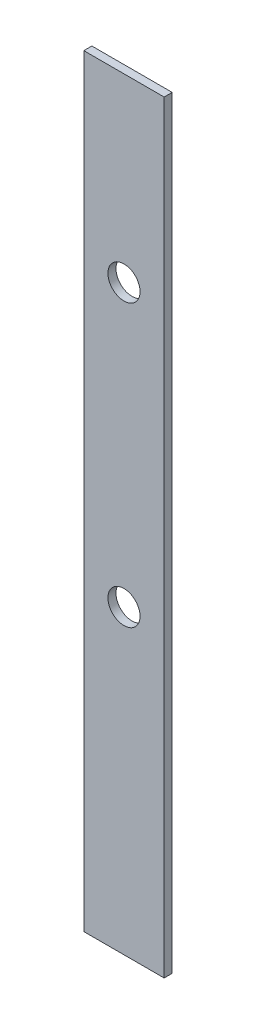
ISO-10303-21;
HEADER;
FILE_DESCRIPTION(('STEP AP214'),'2;1');
FILE_NAME('part.step','',(''),(''),'','','');
FILE_SCHEMA(('AUTOMOTIVE_DESIGN { 1 0 10303 214 1 1 1 1 }'));
ENDSEC;
DATA;
#1=APPLICATION_CONTEXT('core data for automotive mechanical design processes');
#2=APPLICATION_PROTOCOL_DEFINITION('international standard','automotive_design',2000,#1);
#3=PRODUCT_CONTEXT('',#1,'mechanical');
#4=PRODUCT('Part','Part','',(#3));
#5=PRODUCT_RELATED_PRODUCT_CATEGORY('part','',(#4));
#6=PRODUCT_DEFINITION_FORMATION('','',#4);
#7=PRODUCT_DEFINITION_CONTEXT('part definition',#1,'design');
#8=PRODUCT_DEFINITION('design','',#6,#7);
#9=PRODUCT_DEFINITION_SHAPE('','',#8);
#10=(LENGTH_UNIT() NAMED_UNIT(*) SI_UNIT(.MILLI.,.METRE.));
#11=(NAMED_UNIT(*) PLANE_ANGLE_UNIT() SI_UNIT($,.RADIAN.));
#12=(NAMED_UNIT(*) SI_UNIT($,.STERADIAN.) SOLID_ANGLE_UNIT());
#13=UNCERTAINTY_MEASURE_WITH_UNIT(LENGTH_MEASURE(1.E-05),#10,'distance_accuracy_value','');
#14=(GEOMETRIC_REPRESENTATION_CONTEXT(3) GLOBAL_UNCERTAINTY_ASSIGNED_CONTEXT((#13)) GLOBAL_UNIT_ASSIGNED_CONTEXT((#10,
#11,#12)) REPRESENTATION_CONTEXT('',''));
#15=CARTESIAN_POINT('',(0.,0.,0.));
#16=DIRECTION('',(0.,0.,1.));
#17=DIRECTION('',(1.,0.,0.));
#18=AXIS2_PLACEMENT_3D('',#15,#16,#17);
#19=CARTESIAN_POINT('',(-20.,190.,4.));
#20=DIRECTION('',(1.,0.,0.));
#21=DIRECTION('',(0.,1.,0.));
#22=AXIS2_PLACEMENT_3D('',#19,#20,#21);
#23=PLANE('',#22);
#24=DIRECTION('',(0.,-1.,0.));
#25=VECTOR('',#24,1.);
#26=CARTESIAN_POINT('',(-20.,190.,0.));
#27=LINE('',#26,#25);
#28=CARTESIAN_POINT('',(-20.,190.,0.));
#29=VERTEX_POINT('',#28);
#30=CARTESIAN_POINT('',(-20.,-190.,0.));
#31=VERTEX_POINT('',#30);
#32=EDGE_CURVE('E97',#29,#31,#27,.T.);
#33=ORIENTED_EDGE('',*,*,#32,.T.);
#34=DIRECTION('',(0.,0.,-1.));
#35=VECTOR('',#34,1.);
#36=CARTESIAN_POINT('',(-20.,-190.,4.));
#37=LINE('',#36,#35);
#38=CARTESIAN_POINT('',(-20.,-190.,4.));
#39=VERTEX_POINT('',#38);
#40=EDGE_CURVE('E11',#39,#31,#37,.T.);
#41=ORIENTED_EDGE('',*,*,#40,.F.);
#42=DIRECTION('',(0.,-1.,0.));
#43=VECTOR('',#42,1.);
#44=CARTESIAN_POINT('',(-20.,190.,4.));
#45=LINE('',#44,#43);
#46=CARTESIAN_POINT('',(-20.,190.,4.));
#47=VERTEX_POINT('',#46);
#48=EDGE_CURVE('E83',#47,#39,#45,.T.);
#49=ORIENTED_EDGE('',*,*,#48,.F.);
#50=DIRECTION('',(0.,0.,-1.));
#51=VECTOR('',#50,1.);
#52=CARTESIAN_POINT('',(-20.,190.,4.));
#53=LINE('',#52,#51);
#54=EDGE_CURVE('E50',#47,#29,#53,.T.);
#55=ORIENTED_EDGE('',*,*,#54,.T.);
#56=EDGE_LOOP('',(#33,#41,#49,#55));
#57=FACE_BOUND('',#56,.T.);
#58=ADVANCED_FACE('F34',(#57),#23,.F.);
#59=CARTESIAN_POINT('',(-20.,-190.,4.));
#60=DIRECTION('',(0.,1.,0.));
#61=DIRECTION('',(0.,0.,1.));
#62=AXIS2_PLACEMENT_3D('',#59,#60,#61);
#63=PLANE('',#62);
#64=DIRECTION('',(1.,0.,0.));
#65=VECTOR('',#64,1.);
#66=CARTESIAN_POINT('',(-20.,-190.,0.));
#67=LINE('',#66,#65);
#68=CARTESIAN_POINT('',(20.,-190.,0.));
#69=VERTEX_POINT('',#68);
#70=EDGE_CURVE('E88',#31,#69,#67,.T.);
#71=ORIENTED_EDGE('',*,*,#70,.T.);
#72=DIRECTION('',(0.,0.,-1.));
#73=VECTOR('',#72,1.);
#74=CARTESIAN_POINT('',(20.,-190.,4.));
#75=LINE('',#74,#73);
#76=CARTESIAN_POINT('',(20.,-190.,4.));
#77=VERTEX_POINT('',#76);
#78=EDGE_CURVE('E42',#77,#69,#75,.T.);
#79=ORIENTED_EDGE('',*,*,#78,.F.);
#80=DIRECTION('',(1.,0.,0.));
#81=VECTOR('',#80,1.);
#82=CARTESIAN_POINT('',(-20.,-190.,4.));
#83=LINE('',#82,#81);
#84=EDGE_CURVE('E75',#39,#77,#83,.T.);
#85=ORIENTED_EDGE('',*,*,#84,.F.);
#86=ORIENTED_EDGE('',*,*,#40,.T.);
#87=EDGE_LOOP('',(#71,#79,#85,#86));
#88=FACE_BOUND('',#87,.T.);
#89=ADVANCED_FACE('F87',(#88),#63,.F.);
#90=CARTESIAN_POINT('',(20.,190.,4.));
#91=DIRECTION('',(1.,0.,0.));
#92=DIRECTION('',(0.,1.,0.));
#93=AXIS2_PLACEMENT_3D('',#90,#91,#92);
#94=PLANE('',#93);
#95=DIRECTION('',(0.,-1.,0.));
#96=VECTOR('',#95,1.);
#97=CARTESIAN_POINT('',(20.,190.,0.));
#98=LINE('',#97,#96);
#99=CARTESIAN_POINT('',(20.,190.,0.));
#100=VERTEX_POINT('',#99);
#101=EDGE_CURVE('E101',#100,#69,#98,.T.);
#102=ORIENTED_EDGE('',*,*,#101,.F.);
#103=DIRECTION('',(0.,0.,-1.));
#104=VECTOR('',#103,1.);
#105=CARTESIAN_POINT('',(20.,190.,4.));
#106=LINE('',#105,#104);
#107=CARTESIAN_POINT('',(20.,190.,4.));
#108=VERTEX_POINT('',#107);
#109=EDGE_CURVE('E64',#108,#100,#106,.T.);
#110=ORIENTED_EDGE('',*,*,#109,.F.);
#111=DIRECTION('',(0.,-1.,0.));
#112=VECTOR('',#111,1.);
#113=CARTESIAN_POINT('',(20.,190.,4.));
#114=LINE('',#113,#112);
#115=EDGE_CURVE('E82',#108,#77,#114,.T.);
#116=ORIENTED_EDGE('',*,*,#115,.T.);
#117=ORIENTED_EDGE('',*,*,#78,.T.);
#118=EDGE_LOOP('',(#102,#110,#116,#117));
#119=FACE_BOUND('',#118,.T.);
#120=ADVANCED_FACE('F91',(#119),#94,.T.);
#121=CARTESIAN_POINT('',(-20.,190.,4.));
#122=DIRECTION('',(0.,1.,0.));
#123=DIRECTION('',(0.,0.,1.));
#124=AXIS2_PLACEMENT_3D('',#121,#122,#123);
#125=PLANE('',#124);
#126=DIRECTION('',(1.,0.,0.));
#127=VECTOR('',#126,1.);
#128=CARTESIAN_POINT('',(-20.,190.,0.));
#129=LINE('',#128,#127);
#130=EDGE_CURVE('E103',#29,#100,#129,.T.);
#131=ORIENTED_EDGE('',*,*,#130,.F.);
#132=ORIENTED_EDGE('',*,*,#54,.F.);
#133=DIRECTION('',(1.,0.,0.));
#134=VECTOR('',#133,1.);
#135=CARTESIAN_POINT('',(-20.,190.,4.));
#136=LINE('',#135,#134);
#137=EDGE_CURVE('E92',#47,#108,#136,.T.);
#138=ORIENTED_EDGE('',*,*,#137,.T.);
#139=ORIENTED_EDGE('',*,*,#109,.T.);
#140=EDGE_LOOP('',(#131,#132,#138,#139));
#141=FACE_BOUND('',#140,.T.);
#142=ADVANCED_FACE('F135',(#141),#125,.T.);
#143=CARTESIAN_POINT('',(0.,0.,4.));
#144=DIRECTION('',(0.,0.,1.));
#145=DIRECTION('',(1.,0.,0.));
#146=AXIS2_PLACEMENT_3D('',#143,#144,#145);
#147=PLANE('',#146);
#148=CARTESIAN_POINT('',(0.,100.,4.));
#149=DIRECTION('',(0.,0.,-1.));
#150=DIRECTION('',(-1.,0.,0.));
#151=AXIS2_PLACEMENT_3D('',#148,#149,#150);
#152=CIRCLE('',#151,8.);
#153=CARTESIAN_POINT('',(-8.00000000000002,100.,4.));
#154=VERTEX_POINT('',#153);
#155=EDGE_CURVE('E99',#154,#154,#152,.T.);
#156=ORIENTED_EDGE('',*,*,#155,.T.);
#157=EDGE_LOOP('',(#156));
#158=FACE_BOUND('',#157,.T.);
#159=CARTESIAN_POINT('',(0.,-39.9999999999999,4.));
#160=DIRECTION('',(0.,0.,-1.));
#161=DIRECTION('',(-1.,0.,0.));
#162=AXIS2_PLACEMENT_3D('',#159,#160,#161);
#163=CIRCLE('',#162,8.);
#164=CARTESIAN_POINT('',(-7.99999999999997,-39.9999999999999,4.));
#165=VERTEX_POINT('',#164);
#166=EDGE_CURVE('E109',#165,#165,#163,.T.);
#167=ORIENTED_EDGE('',*,*,#166,.T.);
#168=EDGE_LOOP('',(#167));
#169=FACE_BOUND('',#168,.T.);
#170=ORIENTED_EDGE('',*,*,#48,.T.);
#171=ORIENTED_EDGE('',*,*,#84,.T.);
#172=ORIENTED_EDGE('',*,*,#115,.F.);
#173=ORIENTED_EDGE('',*,*,#137,.F.);
#174=EDGE_LOOP('',(#170,#171,#172,#173));
#175=FACE_BOUND('',#174,.T.);
#176=ADVANCED_FACE('F79',(#158,#169,#175),#147,.T.);
#177=CARTESIAN_POINT('',(0.,0.,0.));
#178=DIRECTION('',(0.,0.,1.));
#179=DIRECTION('',(1.,0.,0.));
#180=AXIS2_PLACEMENT_3D('',#177,#178,#179);
#181=PLANE('',#180);
#182=CARTESIAN_POINT('',(0.,100.,0.));
#183=DIRECTION('',(0.,0.,-1.));
#184=DIRECTION('',(-1.,0.,0.));
#185=AXIS2_PLACEMENT_3D('',#182,#183,#184);
#186=CIRCLE('',#185,8.);
#187=CARTESIAN_POINT('',(-8.00000000000002,100.,0.));
#188=VERTEX_POINT('',#187);
#189=EDGE_CURVE('E115',#188,#188,#186,.T.);
#190=ORIENTED_EDGE('',*,*,#189,.F.);
#191=EDGE_LOOP('',(#190));
#192=FACE_BOUND('',#191,.T.);
#193=CARTESIAN_POINT('',(0.,-39.9999999999999,0.));
#194=DIRECTION('',(0.,0.,-1.));
#195=DIRECTION('',(-1.,0.,0.));
#196=AXIS2_PLACEMENT_3D('',#193,#194,#195);
#197=CIRCLE('',#196,8.);
#198=CARTESIAN_POINT('',(-7.99999999999997,-39.9999999999999,0.));
#199=VERTEX_POINT('',#198);
#200=EDGE_CURVE('E112',#199,#199,#197,.T.);
#201=ORIENTED_EDGE('',*,*,#200,.F.);
#202=EDGE_LOOP('',(#201));
#203=FACE_BOUND('',#202,.T.);
#204=ORIENTED_EDGE('',*,*,#32,.F.);
#205=ORIENTED_EDGE('',*,*,#130,.T.);
#206=ORIENTED_EDGE('',*,*,#101,.T.);
#207=ORIENTED_EDGE('',*,*,#70,.F.);
#208=EDGE_LOOP('',(#204,#205,#206,#207));
#209=FACE_BOUND('',#208,.T.);
#210=ADVANCED_FACE('F130',(#192,#203,#209),#181,.F.);
#211=CARTESIAN_POINT('',(0.,-39.9999999999999,4.));
#212=DIRECTION('',(0.,0.,-1.));
#213=DIRECTION('',(-1.,0.,0.));
#214=AXIS2_PLACEMENT_3D('',#211,#212,#213);
#215=CYLINDRICAL_SURFACE('',#214,8.);
#216=ORIENTED_EDGE('',*,*,#166,.F.);
#217=EDGE_LOOP('',(#216));
#218=FACE_BOUND('',#217,.T.);
#219=ORIENTED_EDGE('',*,*,#200,.T.);
#220=EDGE_LOOP('',(#219));
#221=FACE_BOUND('',#220,.T.);
#222=ADVANCED_FACE('F126',(#218,#221),#215,.F.);
#223=CARTESIAN_POINT('',(0.,100.,4.));
#224=DIRECTION('',(0.,0.,-1.));
#225=DIRECTION('',(-1.,0.,0.));
#226=AXIS2_PLACEMENT_3D('',#223,#224,#225);
#227=CYLINDRICAL_SURFACE('',#226,8.);
#228=ORIENTED_EDGE('',*,*,#155,.F.);
#229=EDGE_LOOP('',(#228));
#230=FACE_BOUND('',#229,.T.);
#231=ORIENTED_EDGE('',*,*,#189,.T.);
#232=EDGE_LOOP('',(#231));
#233=FACE_BOUND('',#232,.T.);
#234=ADVANCED_FACE('F123',(#230,#233),#227,.F.);
#235=CLOSED_SHELL('',(#58,#89,#120,#142,#176,#210,#222,#234));
#236=MANIFOLD_SOLID_BREP('B2',#235);
#237=ADVANCED_BREP_SHAPE_REPRESENTATION('',(#18,#236),#14);
#238=SHAPE_DEFINITION_REPRESENTATION(#9,#237);
ENDSEC;
END-ISO-10303-21;
